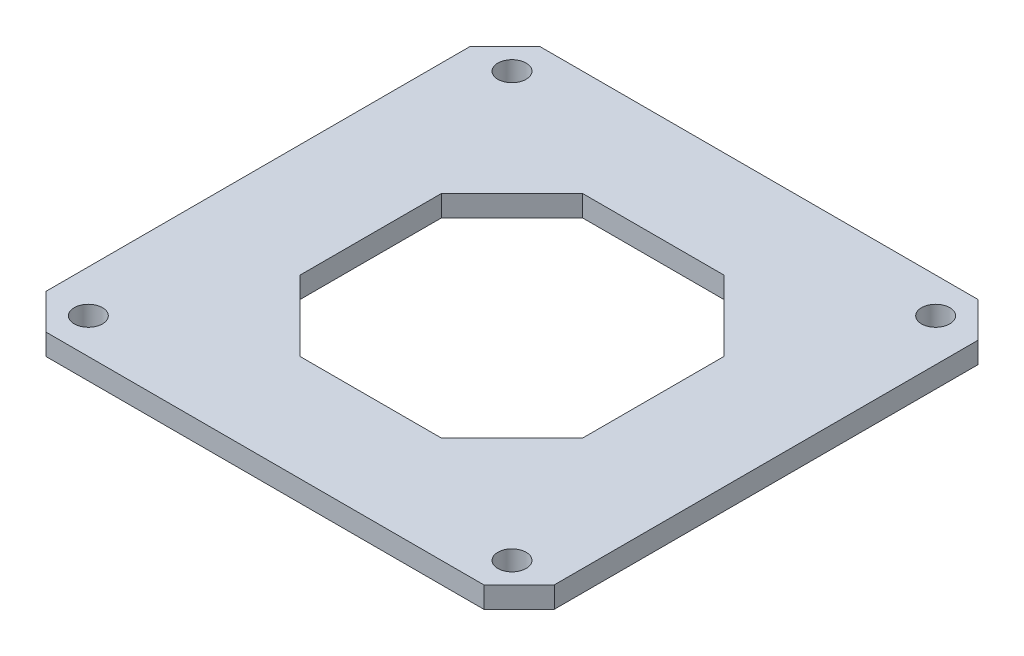
ISO-10303-21;
HEADER;
FILE_DESCRIPTION(('STEP AP214'),'2;1');
FILE_NAME('part.step','',(''),(''),'','','');
FILE_SCHEMA(('AUTOMOTIVE_DESIGN { 1 0 10303 214 1 1 1 1 }'));
ENDSEC;
DATA;
#1=APPLICATION_CONTEXT('core data for automotive mechanical design processes');
#2=APPLICATION_PROTOCOL_DEFINITION('international standard','automotive_design',2000,#1);
#3=PRODUCT_CONTEXT('',#1,'mechanical');
#4=PRODUCT('Part','Part','',(#3));
#5=PRODUCT_RELATED_PRODUCT_CATEGORY('part','',(#4));
#6=PRODUCT_DEFINITION_FORMATION('','',#4);
#7=PRODUCT_DEFINITION_CONTEXT('part definition',#1,'design');
#8=PRODUCT_DEFINITION('design','',#6,#7);
#9=PRODUCT_DEFINITION_SHAPE('','',#8);
#10=(LENGTH_UNIT() NAMED_UNIT(*) SI_UNIT(.MILLI.,.METRE.));
#11=(NAMED_UNIT(*) PLANE_ANGLE_UNIT() SI_UNIT($,.RADIAN.));
#12=(NAMED_UNIT(*) SI_UNIT($,.STERADIAN.) SOLID_ANGLE_UNIT());
#13=UNCERTAINTY_MEASURE_WITH_UNIT(LENGTH_MEASURE(1.E-05),#10,'distance_accuracy_value','');
#14=(GEOMETRIC_REPRESENTATION_CONTEXT(3) GLOBAL_UNCERTAINTY_ASSIGNED_CONTEXT((#13)) GLOBAL_UNIT_ASSIGNED_CONTEXT((#10,
#11,#12)) REPRESENTATION_CONTEXT('',''));
#15=CARTESIAN_POINT('',(0.,0.,0.));
#16=DIRECTION('',(0.,0.,1.));
#17=DIRECTION('',(1.,0.,0.));
#18=AXIS2_PLACEMENT_3D('',#15,#16,#17);
#19=CARTESIAN_POINT('',(0.,3.,35.));
#20=DIRECTION('',(0.,0.,-1.));
#21=DIRECTION('',(-1.,0.,0.));
#22=AXIS2_PLACEMENT_3D('',#19,#20,#21);
#23=PLANE('',#22);
#24=DIRECTION('',(1.,0.,0.));
#25=VECTOR('',#24,1.);
#26=CARTESIAN_POINT('',(0.,0.,35.));
#27=LINE('',#26,#25);
#28=CARTESIAN_POINT('',(-31.,0.,35.));
#29=VERTEX_POINT('',#28);
#30=CARTESIAN_POINT('',(31.,0.,35.));
#31=VERTEX_POINT('',#30);
#32=EDGE_CURVE('E199',#29,#31,#27,.T.);
#33=ORIENTED_EDGE('',*,*,#32,.T.);
#34=DIRECTION('',(0.,1.,0.));
#35=VECTOR('',#34,1.);
#36=CARTESIAN_POINT('',(31.,3.,35.));
#37=LINE('',#36,#35);
#38=CARTESIAN_POINT('',(31.,3.,35.));
#39=VERTEX_POINT('',#38);
#40=EDGE_CURVE('E310',#31,#39,#37,.T.);
#41=ORIENTED_EDGE('',*,*,#40,.T.);
#42=DIRECTION('',(1.,0.,0.));
#43=VECTOR('',#42,1.);
#44=CARTESIAN_POINT('',(0.,3.,35.));
#45=LINE('',#44,#43);
#46=CARTESIAN_POINT('',(-31.,3.,35.));
#47=VERTEX_POINT('',#46);
#48=EDGE_CURVE('E329',#47,#39,#45,.T.);
#49=ORIENTED_EDGE('',*,*,#48,.F.);
#50=DIRECTION('',(0.,-1.,0.));
#51=VECTOR('',#50,1.);
#52=CARTESIAN_POINT('',(-31.,0.,35.));
#53=LINE('',#52,#51);
#54=EDGE_CURVE('E306',#47,#29,#53,.T.);
#55=ORIENTED_EDGE('',*,*,#54,.T.);
#56=EDGE_LOOP('',(#33,#41,#49,#55));
#57=FACE_BOUND('',#56,.T.);
#58=ADVANCED_FACE('F47',(#57),#23,.F.);
#59=CARTESIAN_POINT('',(36.,3.,0.));
#60=DIRECTION('',(-1.,0.,0.));
#61=DIRECTION('',(0.,0.,1.));
#62=AXIS2_PLACEMENT_3D('',#59,#60,#61);
#63=PLANE('',#62);
#64=DIRECTION('',(0.,0.,-1.));
#65=VECTOR('',#64,1.);
#66=CARTESIAN_POINT('',(36.,0.,0.));
#67=LINE('',#66,#65);
#68=CARTESIAN_POINT('',(36.,0.,30.));
#69=VERTEX_POINT('',#68);
#70=CARTESIAN_POINT('',(36.,0.,-30.));
#71=VERTEX_POINT('',#70);
#72=EDGE_CURVE('E208',#69,#71,#67,.T.);
#73=ORIENTED_EDGE('',*,*,#72,.T.);
#74=DIRECTION('',(0.,1.,0.));
#75=VECTOR('',#74,1.);
#76=CARTESIAN_POINT('',(36.,3.,-30.));
#77=LINE('',#76,#75);
#78=CARTESIAN_POINT('',(36.,3.,-30.));
#79=VERTEX_POINT('',#78);
#80=EDGE_CURVE('E292',#71,#79,#77,.T.);
#81=ORIENTED_EDGE('',*,*,#80,.T.);
#82=DIRECTION('',(0.,0.,-1.));
#83=VECTOR('',#82,1.);
#84=CARTESIAN_POINT('',(36.,3.,0.));
#85=LINE('',#84,#83);
#86=CARTESIAN_POINT('',(36.,3.,30.));
#87=VERTEX_POINT('',#86);
#88=EDGE_CURVE('E332',#87,#79,#85,.T.);
#89=ORIENTED_EDGE('',*,*,#88,.F.);
#90=DIRECTION('',(0.,-1.,0.));
#91=VECTOR('',#90,1.);
#92=CARTESIAN_POINT('',(36.,3.,30.));
#93=LINE('',#92,#91);
#94=EDGE_CURVE('E288',#87,#69,#93,.T.);
#95=ORIENTED_EDGE('',*,*,#94,.T.);
#96=EDGE_LOOP('',(#73,#81,#89,#95));
#97=FACE_BOUND('',#96,.T.);
#98=ADVANCED_FACE('F424',(#97),#63,.F.);
#99=CARTESIAN_POINT('',(0.,3.,-35.));
#100=DIRECTION('',(0.,0.,-1.));
#101=DIRECTION('',(-1.,0.,0.));
#102=AXIS2_PLACEMENT_3D('',#99,#100,#101);
#103=PLANE('',#102);
#104=DIRECTION('',(1.,0.,0.));
#105=VECTOR('',#104,1.);
#106=CARTESIAN_POINT('',(0.,3.,-35.));
#107=LINE('',#106,#105);
#108=CARTESIAN_POINT('',(-31.,3.,-35.));
#109=VERTEX_POINT('',#108);
#110=CARTESIAN_POINT('',(31.,3.,-35.));
#111=VERTEX_POINT('',#110);
#112=EDGE_CURVE('E338',#109,#111,#107,.T.);
#113=ORIENTED_EDGE('',*,*,#112,.T.);
#114=DIRECTION('',(0.,-1.,0.));
#115=VECTOR('',#114,1.);
#116=CARTESIAN_POINT('',(31.,0.,-35.));
#117=LINE('',#116,#115);
#118=CARTESIAN_POINT('',(31.,0.,-35.));
#119=VERTEX_POINT('',#118);
#120=EDGE_CURVE('E272',#111,#119,#117,.T.);
#121=ORIENTED_EDGE('',*,*,#120,.T.);
#122=DIRECTION('',(1.,0.,0.));
#123=VECTOR('',#122,1.);
#124=CARTESIAN_POINT('',(0.,0.,-35.));
#125=LINE('',#124,#123);
#126=CARTESIAN_POINT('',(-31.,0.,-35.));
#127=VERTEX_POINT('',#126);
#128=EDGE_CURVE('E212',#127,#119,#125,.T.);
#129=ORIENTED_EDGE('',*,*,#128,.F.);
#130=DIRECTION('',(0.,1.,0.));
#131=VECTOR('',#130,1.);
#132=CARTESIAN_POINT('',(-31.,3.,-35.));
#133=LINE('',#132,#131);
#134=EDGE_CURVE('E269',#127,#109,#133,.T.);
#135=ORIENTED_EDGE('',*,*,#134,.T.);
#136=EDGE_LOOP('',(#113,#121,#129,#135));
#137=FACE_BOUND('',#136,.T.);
#138=ADVANCED_FACE('F429',(#137),#103,.T.);
#139=CARTESIAN_POINT('',(20.,3.,0.));
#140=DIRECTION('',(-1.,0.,0.));
#141=DIRECTION('',(0.,0.,1.));
#142=AXIS2_PLACEMENT_3D('',#139,#140,#141);
#143=PLANE('',#142);
#144=DIRECTION('',(0.,0.,-1.));
#145=VECTOR('',#144,1.);
#146=CARTESIAN_POINT('',(20.,0.,0.));
#147=LINE('',#146,#145);
#148=CARTESIAN_POINT('',(20.,0.,10.));
#149=VERTEX_POINT('',#148);
#150=CARTESIAN_POINT('',(20.,0.,-9.99999999999992));
#151=VERTEX_POINT('',#150);
#152=EDGE_CURVE('E201',#149,#151,#147,.T.);
#153=ORIENTED_EDGE('',*,*,#152,.F.);
#154=DIRECTION('',(0.,1.,0.));
#155=VECTOR('',#154,1.);
#156=CARTESIAN_POINT('',(20.,3.,10.));
#157=LINE('',#156,#155);
#158=CARTESIAN_POINT('',(20.,3.,10.));
#159=VERTEX_POINT('',#158);
#160=EDGE_CURVE('E241',#149,#159,#157,.T.);
#161=ORIENTED_EDGE('',*,*,#160,.T.);
#162=DIRECTION('',(0.,0.,-1.));
#163=VECTOR('',#162,1.);
#164=CARTESIAN_POINT('',(20.,3.,0.));
#165=LINE('',#164,#163);
#166=CARTESIAN_POINT('',(20.,3.,-9.99999999999992));
#167=VERTEX_POINT('',#166);
#168=EDGE_CURVE('E381',#159,#167,#165,.T.);
#169=ORIENTED_EDGE('',*,*,#168,.T.);
#170=DIRECTION('',(0.,-1.,0.));
#171=VECTOR('',#170,1.);
#172=CARTESIAN_POINT('',(20.,3.,-9.99999999999992));
#173=LINE('',#172,#171);
#174=EDGE_CURVE('E237',#167,#151,#173,.T.);
#175=ORIENTED_EDGE('',*,*,#174,.T.);
#176=EDGE_LOOP('',(#153,#161,#169,#175));
#177=FACE_BOUND('',#176,.T.);
#178=ADVANCED_FACE('F368',(#177),#143,.T.);
#179=CARTESIAN_POINT('',(0.,3.,20.));
#180=DIRECTION('',(0.,0.,-1.));
#181=DIRECTION('',(-1.,0.,0.));
#182=AXIS2_PLACEMENT_3D('',#179,#180,#181);
#183=PLANE('',#182);
#184=DIRECTION('',(1.,0.,0.));
#185=VECTOR('',#184,1.);
#186=CARTESIAN_POINT('',(0.,0.,20.));
#187=LINE('',#186,#185);
#188=CARTESIAN_POINT('',(-10.,0.,20.));
#189=VERTEX_POINT('',#188);
#190=CARTESIAN_POINT('',(9.99999999999992,0.,20.));
#191=VERTEX_POINT('',#190);
#192=EDGE_CURVE('E194',#189,#191,#187,.T.);
#193=ORIENTED_EDGE('',*,*,#192,.F.);
#194=DIRECTION('',(0.,1.,0.));
#195=VECTOR('',#194,1.);
#196=CARTESIAN_POINT('',(-10.,3.,20.));
#197=LINE('',#196,#195);
#198=CARTESIAN_POINT('',(-10.,3.,20.));
#199=VERTEX_POINT('',#198);
#200=EDGE_CURVE('E167',#189,#199,#197,.T.);
#201=ORIENTED_EDGE('',*,*,#200,.T.);
#202=DIRECTION('',(1.,0.,0.));
#203=VECTOR('',#202,1.);
#204=CARTESIAN_POINT('',(0.,3.,20.));
#205=LINE('',#204,#203);
#206=CARTESIAN_POINT('',(9.99999999999992,3.,20.));
#207=VERTEX_POINT('',#206);
#208=EDGE_CURVE('E380',#199,#207,#205,.T.);
#209=ORIENTED_EDGE('',*,*,#208,.T.);
#210=DIRECTION('',(0.,-1.,0.));
#211=VECTOR('',#210,1.);
#212=CARTESIAN_POINT('',(9.99999999999992,0.,20.));
#213=LINE('',#212,#211);
#214=EDGE_CURVE('E185',#207,#191,#213,.T.);
#215=ORIENTED_EDGE('',*,*,#214,.T.);
#216=EDGE_LOOP('',(#193,#201,#209,#215));
#217=FACE_BOUND('',#216,.T.);
#218=ADVANCED_FACE('F383',(#217),#183,.T.);
#219=CARTESIAN_POINT('',(-20.,3.,0.));
#220=DIRECTION('',(-1.,0.,0.));
#221=DIRECTION('',(0.,0.,1.));
#222=AXIS2_PLACEMENT_3D('',#219,#220,#221);
#223=PLANE('',#222);
#224=DIRECTION('',(0.,0.,-1.));
#225=VECTOR('',#224,1.);
#226=CARTESIAN_POINT('',(-20.,3.,0.));
#227=LINE('',#226,#225);
#228=CARTESIAN_POINT('',(-20.,3.,9.99999999999993));
#229=VERTEX_POINT('',#228);
#230=CARTESIAN_POINT('',(-20.,3.,-10.));
#231=VERTEX_POINT('',#230);
#232=EDGE_CURVE('E183',#229,#231,#227,.T.);
#233=ORIENTED_EDGE('',*,*,#232,.F.);
#234=DIRECTION('',(0.,-1.,0.));
#235=VECTOR('',#234,1.);
#236=CARTESIAN_POINT('',(-20.,3.,9.99999999999993));
#237=LINE('',#236,#235);
#238=CARTESIAN_POINT('',(-20.,0.,9.99999999999993));
#239=VERTEX_POINT('',#238);
#240=EDGE_CURVE('E166',#229,#239,#237,.T.);
#241=ORIENTED_EDGE('',*,*,#240,.T.);
#242=DIRECTION('',(0.,0.,-1.));
#243=VECTOR('',#242,1.);
#244=CARTESIAN_POINT('',(-20.,0.,0.));
#245=LINE('',#244,#243);
#246=CARTESIAN_POINT('',(-20.,0.,-10.));
#247=VERTEX_POINT('',#246);
#248=EDGE_CURVE('E180',#239,#247,#245,.T.);
#249=ORIENTED_EDGE('',*,*,#248,.T.);
#250=DIRECTION('',(0.,1.,0.));
#251=VECTOR('',#250,1.);
#252=CARTESIAN_POINT('',(-20.,3.,-10.));
#253=LINE('',#252,#251);
#254=EDGE_CURVE('E186',#247,#231,#253,.T.);
#255=ORIENTED_EDGE('',*,*,#254,.T.);
#256=EDGE_LOOP('',(#233,#241,#249,#255));
#257=FACE_BOUND('',#256,.T.);
#258=ADVANCED_FACE('F179',(#257),#223,.F.);
#259=CARTESIAN_POINT('',(30.,3.,30.));
#260=DIRECTION('',(0.,-1.,0.));
#261=DIRECTION('',(0.,0.,-1.));
#262=AXIS2_PLACEMENT_3D('',#259,#260,#261);
#263=CYLINDRICAL_SURFACE('',#262,2.00000000000001);
#264=CARTESIAN_POINT('',(30.,3.,30.));
#265=DIRECTION('',(0.,1.,0.));
#266=DIRECTION('',(0.,0.,1.));
#267=AXIS2_PLACEMENT_3D('',#264,#265,#266);
#268=CIRCLE('',#267,2.00000000000001);
#269=CARTESIAN_POINT('',(30.,3.,32.));
#270=VERTEX_POINT('',#269);
#271=EDGE_CURVE('E349',#270,#270,#268,.T.);
#272=ORIENTED_EDGE('',*,*,#271,.T.);
#273=EDGE_LOOP('',(#272));
#274=FACE_BOUND('',#273,.T.);
#275=CARTESIAN_POINT('',(30.,0.,30.));
#276=DIRECTION('',(0.,1.,0.));
#277=DIRECTION('',(0.,0.,1.));
#278=AXIS2_PLACEMENT_3D('',#275,#276,#277);
#279=CIRCLE('',#278,2.00000000000001);
#280=CARTESIAN_POINT('',(30.,0.,32.));
#281=VERTEX_POINT('',#280);
#282=EDGE_CURVE('E220',#281,#281,#279,.T.);
#283=ORIENTED_EDGE('',*,*,#282,.F.);
#284=EDGE_LOOP('',(#283));
#285=FACE_BOUND('',#284,.T.);
#286=ADVANCED_FACE('F436',(#274,#285),#263,.F.);
#287=CARTESIAN_POINT('',(-36.,3.,0.));
#288=DIRECTION('',(-1.,0.,0.));
#289=DIRECTION('',(0.,0.,1.));
#290=AXIS2_PLACEMENT_3D('',#287,#288,#289);
#291=PLANE('',#290);
#292=DIRECTION('',(0.,0.,-1.));
#293=VECTOR('',#292,1.);
#294=CARTESIAN_POINT('',(-36.,0.,0.));
#295=LINE('',#294,#293);
#296=CARTESIAN_POINT('',(-36.,0.,30.));
#297=VERTEX_POINT('',#296);
#298=CARTESIAN_POINT('',(-36.,0.,-30.));
#299=VERTEX_POINT('',#298);
#300=EDGE_CURVE('E216',#297,#299,#295,.T.);
#301=ORIENTED_EDGE('',*,*,#300,.F.);
#302=DIRECTION('',(0.,1.,0.));
#303=VECTOR('',#302,1.);
#304=CARTESIAN_POINT('',(-36.,3.,30.));
#305=LINE('',#304,#303);
#306=CARTESIAN_POINT('',(-36.,3.,30.));
#307=VERTEX_POINT('',#306);
#308=EDGE_CURVE('E11',#297,#307,#305,.T.);
#309=ORIENTED_EDGE('',*,*,#308,.T.);
#310=DIRECTION('',(0.,0.,-1.));
#311=VECTOR('',#310,1.);
#312=CARTESIAN_POINT('',(-36.,3.,0.));
#313=LINE('',#312,#311);
#314=CARTESIAN_POINT('',(-36.,3.,-30.));
#315=VERTEX_POINT('',#314);
#316=EDGE_CURVE('E316',#307,#315,#313,.T.);
#317=ORIENTED_EDGE('',*,*,#316,.T.);
#318=DIRECTION('',(0.,-1.,0.));
#319=VECTOR('',#318,1.);
#320=CARTESIAN_POINT('',(-36.,3.,-30.));
#321=LINE('',#320,#319);
#322=EDGE_CURVE('E57',#315,#299,#321,.T.);
#323=ORIENTED_EDGE('',*,*,#322,.T.);
#324=EDGE_LOOP('',(#301,#309,#317,#323));
#325=FACE_BOUND('',#324,.T.);
#326=ADVANCED_FACE('F315',(#325),#291,.T.);
#327=CARTESIAN_POINT('',(0.,3.,-20.));
#328=DIRECTION('',(0.,0.,-1.));
#329=DIRECTION('',(-1.,0.,0.));
#330=AXIS2_PLACEMENT_3D('',#327,#328,#329);
#331=PLANE('',#330);
#332=DIRECTION('',(1.,0.,0.));
#333=VECTOR('',#332,1.);
#334=CARTESIAN_POINT('',(0.,0.,-20.));
#335=LINE('',#334,#333);
#336=CARTESIAN_POINT('',(-9.99999999999994,0.,-20.));
#337=VERTEX_POINT('',#336);
#338=CARTESIAN_POINT('',(10.,0.,-20.));
#339=VERTEX_POINT('',#338);
#340=EDGE_CURVE('E193',#337,#339,#335,.T.);
#341=ORIENTED_EDGE('',*,*,#340,.T.);
#342=DIRECTION('',(0.,1.,0.));
#343=VECTOR('',#342,1.);
#344=CARTESIAN_POINT('',(10.,3.,-20.));
#345=LINE('',#344,#343);
#346=CARTESIAN_POINT('',(10.,3.,-20.));
#347=VERTEX_POINT('',#346);
#348=EDGE_CURVE('E174',#339,#347,#345,.T.);
#349=ORIENTED_EDGE('',*,*,#348,.T.);
#350=DIRECTION('',(1.,0.,0.));
#351=VECTOR('',#350,1.);
#352=CARTESIAN_POINT('',(0.,3.,-20.));
#353=LINE('',#352,#351);
#354=CARTESIAN_POINT('',(-9.99999999999994,3.,-20.));
#355=VERTEX_POINT('',#354);
#356=EDGE_CURVE('E333',#355,#347,#353,.T.);
#357=ORIENTED_EDGE('',*,*,#356,.F.);
#358=DIRECTION('',(0.,-1.,0.));
#359=VECTOR('',#358,1.);
#360=CARTESIAN_POINT('',(-9.99999999999994,0.,-20.));
#361=LINE('',#360,#359);
#362=EDGE_CURVE('E244',#355,#337,#361,.T.);
#363=ORIENTED_EDGE('',*,*,#362,.T.);
#364=EDGE_LOOP('',(#341,#349,#357,#363));
#365=FACE_BOUND('',#364,.T.);
#366=ADVANCED_FACE('F414',(#365),#331,.F.);
#367=CARTESIAN_POINT('',(-30.,3.,-30.));
#368=DIRECTION('',(0.,-1.,0.));
#369=DIRECTION('',(0.,0.,-1.));
#370=AXIS2_PLACEMENT_3D('',#367,#368,#369);
#371=CYLINDRICAL_SURFACE('',#370,2.00000000000001);
#372=CARTESIAN_POINT('',(-30.,3.,-30.));
#373=DIRECTION('',(0.,1.,0.));
#374=DIRECTION('',(0.,0.,1.));
#375=AXIS2_PLACEMENT_3D('',#372,#373,#374);
#376=CIRCLE('',#375,2.00000000000001);
#377=CARTESIAN_POINT('',(-30.,3.,-28.));
#378=VERTEX_POINT('',#377);
#379=EDGE_CURVE('E388',#378,#378,#376,.T.);
#380=ORIENTED_EDGE('',*,*,#379,.T.);
#381=EDGE_LOOP('',(#380));
#382=FACE_BOUND('',#381,.T.);
#383=CARTESIAN_POINT('',(-30.,0.,-30.));
#384=DIRECTION('',(0.,1.,0.));
#385=DIRECTION('',(0.,0.,1.));
#386=AXIS2_PLACEMENT_3D('',#383,#384,#385);
#387=CIRCLE('',#386,2.00000000000001);
#388=CARTESIAN_POINT('',(-30.,0.,-28.));
#389=VERTEX_POINT('',#388);
#390=EDGE_CURVE('E360',#389,#389,#387,.T.);
#391=ORIENTED_EDGE('',*,*,#390,.F.);
#392=EDGE_LOOP('',(#391));
#393=FACE_BOUND('',#392,.T.);
#394=ADVANCED_FACE('F404',(#382,#393),#371,.F.);
#395=CARTESIAN_POINT('',(30.,3.,-30.));
#396=DIRECTION('',(0.,-1.,0.));
#397=DIRECTION('',(0.,0.,-1.));
#398=AXIS2_PLACEMENT_3D('',#395,#396,#397);
#399=CYLINDRICAL_SURFACE('',#398,2.00000000000001);
#400=CARTESIAN_POINT('',(30.,3.,-30.));
#401=DIRECTION('',(0.,1.,0.));
#402=DIRECTION('',(0.,0.,1.));
#403=AXIS2_PLACEMENT_3D('',#400,#401,#402);
#404=CIRCLE('',#403,2.00000000000001);
#405=CARTESIAN_POINT('',(30.,3.,-28.));
#406=VERTEX_POINT('',#405);
#407=EDGE_CURVE('E228',#406,#406,#404,.F.);
#408=ORIENTED_EDGE('',*,*,#407,.F.);
#409=EDGE_LOOP('',(#408));
#410=FACE_BOUND('',#409,.T.);
#411=CARTESIAN_POINT('',(30.,0.,-30.));
#412=DIRECTION('',(0.,1.,0.));
#413=DIRECTION('',(0.,0.,1.));
#414=AXIS2_PLACEMENT_3D('',#411,#412,#413);
#415=CIRCLE('',#414,2.00000000000001);
#416=CARTESIAN_POINT('',(30.,0.,-28.));
#417=VERTEX_POINT('',#416);
#418=EDGE_CURVE('E356',#417,#417,#415,.F.);
#419=ORIENTED_EDGE('',*,*,#418,.T.);
#420=EDGE_LOOP('',(#419));
#421=FACE_BOUND('',#420,.T.);
#422=ADVANCED_FACE('F400',(#410,#421),#399,.F.);
#423=CARTESIAN_POINT('',(-30.,3.,30.));
#424=DIRECTION('',(0.,-1.,0.));
#425=DIRECTION('',(0.,0.,-1.));
#426=AXIS2_PLACEMENT_3D('',#423,#424,#425);
#427=CYLINDRICAL_SURFACE('',#426,2.00000000000001);
#428=CARTESIAN_POINT('',(-30.,3.,30.));
#429=DIRECTION('',(0.,1.,0.));
#430=DIRECTION('',(0.,0.,1.));
#431=AXIS2_PLACEMENT_3D('',#428,#429,#430);
#432=CIRCLE('',#431,2.00000000000001);
#433=CARTESIAN_POINT('',(-30.,3.,32.));
#434=VERTEX_POINT('',#433);
#435=EDGE_CURVE('E230',#434,#434,#432,.F.);
#436=ORIENTED_EDGE('',*,*,#435,.F.);
#437=EDGE_LOOP('',(#436));
#438=FACE_BOUND('',#437,.T.);
#439=CARTESIAN_POINT('',(-30.,0.,30.));
#440=DIRECTION('',(0.,1.,0.));
#441=DIRECTION('',(0.,0.,1.));
#442=AXIS2_PLACEMENT_3D('',#439,#440,#441);
#443=CIRCLE('',#442,2.00000000000001);
#444=CARTESIAN_POINT('',(-30.,0.,32.));
#445=VERTEX_POINT('',#444);
#446=EDGE_CURVE('E224',#445,#445,#443,.F.);
#447=ORIENTED_EDGE('',*,*,#446,.T.);
#448=EDGE_LOOP('',(#447));
#449=FACE_BOUND('',#448,.T.);
#450=ADVANCED_FACE('F403',(#438,#449),#427,.F.);
#451=CARTESIAN_POINT('',(0.,3.,0.));
#452=DIRECTION('',(0.,1.,0.));
#453=DIRECTION('',(0.,0.,1.));
#454=AXIS2_PLACEMENT_3D('',#451,#452,#453);
#455=PLANE('',#454);
#456=ORIENTED_EDGE('',*,*,#407,.T.);
#457=EDGE_LOOP('',(#456));
#458=FACE_BOUND('',#457,.T.);
#459=ORIENTED_EDGE('',*,*,#379,.F.);
#460=EDGE_LOOP('',(#459));
#461=FACE_BOUND('',#460,.T.);
#462=ORIENTED_EDGE('',*,*,#168,.F.);
#463=DIRECTION('',(0.707106781186551,0.,-0.707106781186544));
#464=VECTOR('',#463,1.);
#465=CARTESIAN_POINT('',(9.99999999999992,3.,20.));
#466=LINE('',#465,#464);
#467=EDGE_CURVE('E255',#159,#207,#466,.F.);
#468=ORIENTED_EDGE('',*,*,#467,.T.);
#469=ORIENTED_EDGE('',*,*,#208,.F.);
#470=DIRECTION('',(-0.707106781186544,0.,-0.707106781186551));
#471=VECTOR('',#470,1.);
#472=CARTESIAN_POINT('',(-20.,3.,9.99999999999993));
#473=LINE('',#472,#471);
#474=EDGE_CURVE('E173',#199,#229,#473,.T.);
#475=ORIENTED_EDGE('',*,*,#474,.T.);
#476=ORIENTED_EDGE('',*,*,#232,.T.);
#477=DIRECTION('',(-0.707106781186551,0.,0.707106781186544));
#478=VECTOR('',#477,1.);
#479=CARTESIAN_POINT('',(-9.99999999999994,3.,-20.));
#480=LINE('',#479,#478);
#481=EDGE_CURVE('E266',#231,#355,#480,.F.);
#482=ORIENTED_EDGE('',*,*,#481,.T.);
#483=ORIENTED_EDGE('',*,*,#356,.T.);
#484=DIRECTION('',(0.707106781186544,0.,0.707106781186551));
#485=VECTOR('',#484,1.);
#486=CARTESIAN_POINT('',(20.,3.,-9.99999999999992));
#487=LINE('',#486,#485);
#488=EDGE_CURVE('E261',#347,#167,#487,.T.);
#489=ORIENTED_EDGE('',*,*,#488,.T.);
#490=EDGE_LOOP('',(#462,#468,#469,#475,#476,#482,#483,#489));
#491=FACE_BOUND('',#490,.T.);
#492=ORIENTED_EDGE('',*,*,#88,.T.);
#493=DIRECTION('',(-0.707106781186546,0.,-0.707106781186549));
#494=VECTOR('',#493,1.);
#495=CARTESIAN_POINT('',(33.0000000000001,3.,-32.9999999999999));
#496=LINE('',#495,#494);
#497=EDGE_CURVE('E303',#79,#111,#496,.T.);
#498=ORIENTED_EDGE('',*,*,#497,.T.);
#499=ORIENTED_EDGE('',*,*,#112,.F.);
#500=DIRECTION('',(0.70710678118655,0.,-0.707106781186546));
#501=VECTOR('',#500,1.);
#502=CARTESIAN_POINT('',(-32.9999999999999,3.,-33.0000000000001));
#503=LINE('',#502,#501);
#504=EDGE_CURVE('E64',#109,#315,#503,.F.);
#505=ORIENTED_EDGE('',*,*,#504,.T.);
#506=ORIENTED_EDGE('',*,*,#316,.F.);
#507=DIRECTION('',(0.707106781186546,0.,0.70710678118655));
#508=VECTOR('',#507,1.);
#509=CARTESIAN_POINT('',(-33.0000000000001,3.,32.9999999999999));
#510=LINE('',#509,#508);
#511=EDGE_CURVE('E297',#307,#47,#510,.T.);
#512=ORIENTED_EDGE('',*,*,#511,.T.);
#513=ORIENTED_EDGE('',*,*,#48,.T.);
#514=DIRECTION('',(-0.70710678118655,0.,0.707106781186546));
#515=VECTOR('',#514,1.);
#516=CARTESIAN_POINT('',(32.9999999999999,3.,33.0000000000001));
#517=LINE('',#516,#515);
#518=EDGE_CURVE('E300',#39,#87,#517,.F.);
#519=ORIENTED_EDGE('',*,*,#518,.T.);
#520=EDGE_LOOP('',(#492,#498,#499,#505,#506,#512,#513,#519));
#521=FACE_BOUND('',#520,.T.);
#522=ORIENTED_EDGE('',*,*,#271,.F.);
#523=EDGE_LOOP('',(#522));
#524=FACE_BOUND('',#523,.T.);
#525=ORIENTED_EDGE('',*,*,#435,.T.);
#526=EDGE_LOOP('',(#525));
#527=FACE_BOUND('',#526,.T.);
#528=ADVANCED_FACE('F379',(#458,#461,#491,#521,#524,#527),#455,.T.);
#529=CARTESIAN_POINT('',(0.,0.,0.));
#530=DIRECTION('',(0.,1.,0.));
#531=DIRECTION('',(0.,0.,1.));
#532=AXIS2_PLACEMENT_3D('',#529,#530,#531);
#533=PLANE('',#532);
#534=ORIENTED_EDGE('',*,*,#418,.F.);
#535=EDGE_LOOP('',(#534));
#536=FACE_BOUND('',#535,.T.);
#537=ORIENTED_EDGE('',*,*,#390,.T.);
#538=EDGE_LOOP('',(#537));
#539=FACE_BOUND('',#538,.T.);
#540=ORIENTED_EDGE('',*,*,#192,.T.);
#541=DIRECTION('',(-0.707106781186551,0.,0.707106781186544));
#542=VECTOR('',#541,1.);
#543=CARTESIAN_POINT('',(14.9999999999999,0.,15.0000000000001));
#544=LINE('',#543,#542);
#545=EDGE_CURVE('E252',#191,#149,#544,.F.);
#546=ORIENTED_EDGE('',*,*,#545,.T.);
#547=ORIENTED_EDGE('',*,*,#152,.T.);
#548=DIRECTION('',(-0.707106781186544,0.,-0.707106781186551));
#549=VECTOR('',#548,1.);
#550=CARTESIAN_POINT('',(15.0000000000001,0.,-14.9999999999999));
#551=LINE('',#550,#549);
#552=EDGE_CURVE('E258',#151,#339,#551,.T.);
#553=ORIENTED_EDGE('',*,*,#552,.T.);
#554=ORIENTED_EDGE('',*,*,#340,.F.);
#555=DIRECTION('',(0.707106781186551,0.,-0.707106781186544));
#556=VECTOR('',#555,1.);
#557=CARTESIAN_POINT('',(-14.9999999999999,0.,-15.0000000000001));
#558=LINE('',#557,#556);
#559=EDGE_CURVE('E191',#337,#247,#558,.F.);
#560=ORIENTED_EDGE('',*,*,#559,.T.);
#561=ORIENTED_EDGE('',*,*,#248,.F.);
#562=DIRECTION('',(0.707106781186544,0.,0.707106781186551));
#563=VECTOR('',#562,1.);
#564=CARTESIAN_POINT('',(-15.0000000000001,0.,14.9999999999999));
#565=LINE('',#564,#563);
#566=EDGE_CURVE('E162',#239,#189,#565,.T.);
#567=ORIENTED_EDGE('',*,*,#566,.T.);
#568=EDGE_LOOP('',(#540,#546,#547,#553,#554,#560,#561,#567));
#569=FACE_BOUND('',#568,.T.);
#570=ORIENTED_EDGE('',*,*,#128,.T.);
#571=DIRECTION('',(0.707106781186546,0.,0.707106781186549));
#572=VECTOR('',#571,1.);
#573=CARTESIAN_POINT('',(31.,0.,-35.));
#574=LINE('',#573,#572);
#575=EDGE_CURVE('E285',#119,#71,#574,.T.);
#576=ORIENTED_EDGE('',*,*,#575,.T.);
#577=ORIENTED_EDGE('',*,*,#72,.F.);
#578=DIRECTION('',(0.70710678118655,0.,-0.707106781186546));
#579=VECTOR('',#578,1.);
#580=CARTESIAN_POINT('',(36.,0.,30.));
#581=LINE('',#580,#579);
#582=EDGE_CURVE('E282',#69,#31,#581,.F.);
#583=ORIENTED_EDGE('',*,*,#582,.T.);
#584=ORIENTED_EDGE('',*,*,#32,.F.);
#585=DIRECTION('',(-0.707106781186546,0.,-0.70710678118655));
#586=VECTOR('',#585,1.);
#587=CARTESIAN_POINT('',(-31.,0.,35.));
#588=LINE('',#587,#586);
#589=EDGE_CURVE('E279',#29,#297,#588,.T.);
#590=ORIENTED_EDGE('',*,*,#589,.T.);
#591=ORIENTED_EDGE('',*,*,#300,.T.);
#592=DIRECTION('',(-0.70710678118655,0.,0.707106781186546));
#593=VECTOR('',#592,1.);
#594=CARTESIAN_POINT('',(-36.,0.,-30.));
#595=LINE('',#594,#593);
#596=EDGE_CURVE('E276',#299,#127,#595,.F.);
#597=ORIENTED_EDGE('',*,*,#596,.T.);
#598=EDGE_LOOP('',(#570,#576,#577,#583,#584,#590,#591,#597));
#599=FACE_BOUND('',#598,.T.);
#600=ORIENTED_EDGE('',*,*,#282,.T.);
#601=EDGE_LOOP('',(#600));
#602=FACE_BOUND('',#601,.T.);
#603=ORIENTED_EDGE('',*,*,#446,.F.);
#604=EDGE_LOOP('',(#603));
#605=FACE_BOUND('',#604,.T.);
#606=ADVANCED_FACE('F188',(#536,#539,#569,#599,#602,#605),#533,.F.);
#607=CARTESIAN_POINT('',(-20.,3.,9.99999999999993));
#608=DIRECTION('',(-0.707106781186551,0.,0.707106781186544));
#609=DIRECTION('',(0.,-1.,0.));
#610=AXIS2_PLACEMENT_3D('',#607,#608,#609);
#611=PLANE('',#610);
#612=ORIENTED_EDGE('',*,*,#474,.F.);
#613=ORIENTED_EDGE('',*,*,#200,.F.);
#614=ORIENTED_EDGE('',*,*,#566,.F.);
#615=ORIENTED_EDGE('',*,*,#240,.F.);
#616=EDGE_LOOP('',(#612,#613,#614,#615));
#617=FACE_BOUND('',#616,.T.);
#618=ADVANCED_FACE('F165',(#617),#611,.F.);
#619=CARTESIAN_POINT('',(9.99999999999992,3.,20.));
#620=DIRECTION('',(-0.707106781186544,0.,-0.707106781186552));
#621=DIRECTION('',(0.,1.,0.));
#622=AXIS2_PLACEMENT_3D('',#619,#620,#621);
#623=PLANE('',#622);
#624=ORIENTED_EDGE('',*,*,#467,.F.);
#625=ORIENTED_EDGE('',*,*,#160,.F.);
#626=ORIENTED_EDGE('',*,*,#545,.F.);
#627=ORIENTED_EDGE('',*,*,#214,.F.);
#628=EDGE_LOOP('',(#624,#625,#626,#627));
#629=FACE_BOUND('',#628,.T.);
#630=ADVANCED_FACE('F374',(#629),#623,.T.);
#631=CARTESIAN_POINT('',(20.,3.,-9.99999999999992));
#632=DIRECTION('',(0.707106781186552,0.,-0.707106781186544));
#633=DIRECTION('',(0.,-1.,0.));
#634=AXIS2_PLACEMENT_3D('',#631,#632,#633);
#635=PLANE('',#634);
#636=ORIENTED_EDGE('',*,*,#488,.F.);
#637=ORIENTED_EDGE('',*,*,#348,.F.);
#638=ORIENTED_EDGE('',*,*,#552,.F.);
#639=ORIENTED_EDGE('',*,*,#174,.F.);
#640=EDGE_LOOP('',(#636,#637,#638,#639));
#641=FACE_BOUND('',#640,.T.);
#642=ADVANCED_FACE('F478',(#641),#635,.F.);
#643=CARTESIAN_POINT('',(-9.99999999999994,3.,-20.));
#644=DIRECTION('',(0.707106781186544,0.,0.707106781186551));
#645=DIRECTION('',(0.,1.,0.));
#646=AXIS2_PLACEMENT_3D('',#643,#644,#645);
#647=PLANE('',#646);
#648=ORIENTED_EDGE('',*,*,#481,.F.);
#649=ORIENTED_EDGE('',*,*,#254,.F.);
#650=ORIENTED_EDGE('',*,*,#559,.F.);
#651=ORIENTED_EDGE('',*,*,#362,.F.);
#652=EDGE_LOOP('',(#648,#649,#650,#651));
#653=FACE_BOUND('',#652,.T.);
#654=ADVANCED_FACE('F485',(#653),#647,.T.);
#655=CARTESIAN_POINT('',(31.,3.,-35.));
#656=DIRECTION('',(0.707106781186549,0.,-0.707106781186546));
#657=DIRECTION('',(0.,1.,0.));
#658=AXIS2_PLACEMENT_3D('',#655,#656,#657);
#659=PLANE('',#658);
#660=ORIENTED_EDGE('',*,*,#497,.F.);
#661=ORIENTED_EDGE('',*,*,#80,.F.);
#662=ORIENTED_EDGE('',*,*,#575,.F.);
#663=ORIENTED_EDGE('',*,*,#120,.F.);
#664=EDGE_LOOP('',(#660,#661,#662,#663));
#665=FACE_BOUND('',#664,.T.);
#666=ADVANCED_FACE('F493',(#665),#659,.T.);
#667=CARTESIAN_POINT('',(36.,3.,30.));
#668=DIRECTION('',(-0.707106781186545,0.,-0.707106781186549));
#669=DIRECTION('',(0.,-1.,0.));
#670=AXIS2_PLACEMENT_3D('',#667,#668,#669);
#671=PLANE('',#670);
#672=ORIENTED_EDGE('',*,*,#518,.F.);
#673=ORIENTED_EDGE('',*,*,#40,.F.);
#674=ORIENTED_EDGE('',*,*,#582,.F.);
#675=ORIENTED_EDGE('',*,*,#94,.F.);
#676=EDGE_LOOP('',(#672,#673,#674,#675));
#677=FACE_BOUND('',#676,.T.);
#678=ADVANCED_FACE('F500',(#677),#671,.F.);
#679=CARTESIAN_POINT('',(-31.,3.,35.));
#680=DIRECTION('',(-0.707106781186549,0.,0.707106781186545));
#681=DIRECTION('',(0.,1.,0.));
#682=AXIS2_PLACEMENT_3D('',#679,#680,#681);
#683=PLANE('',#682);
#684=ORIENTED_EDGE('',*,*,#511,.F.);
#685=ORIENTED_EDGE('',*,*,#308,.F.);
#686=ORIENTED_EDGE('',*,*,#589,.F.);
#687=ORIENTED_EDGE('',*,*,#54,.F.);
#688=EDGE_LOOP('',(#684,#685,#686,#687));
#689=FACE_BOUND('',#688,.T.);
#690=ADVANCED_FACE('F324',(#689),#683,.T.);
#691=CARTESIAN_POINT('',(-36.,3.,-30.));
#692=DIRECTION('',(0.707106781186545,0.,0.707106781186549));
#693=DIRECTION('',(0.,-1.,0.));
#694=AXIS2_PLACEMENT_3D('',#691,#692,#693);
#695=PLANE('',#694);
#696=ORIENTED_EDGE('',*,*,#504,.F.);
#697=ORIENTED_EDGE('',*,*,#134,.F.);
#698=ORIENTED_EDGE('',*,*,#596,.F.);
#699=ORIENTED_EDGE('',*,*,#322,.F.);
#700=EDGE_LOOP('',(#696,#697,#698,#699));
#701=FACE_BOUND('',#700,.T.);
#702=ADVANCED_FACE('F50',(#701),#695,.F.);
#703=CLOSED_SHELL('',(#58,#98,#138,#178,#218,#258,#286,#326,#366,#394,#422,#450,#528,#606,#618,
#630,#642,#654,#666,#678,#690,#702));
#704=MANIFOLD_SOLID_BREP('B2',#703);
#705=ADVANCED_BREP_SHAPE_REPRESENTATION('',(#18,#704),#14);
#706=SHAPE_DEFINITION_REPRESENTATION(#9,#705);
ENDSEC;
END-ISO-10303-21;
